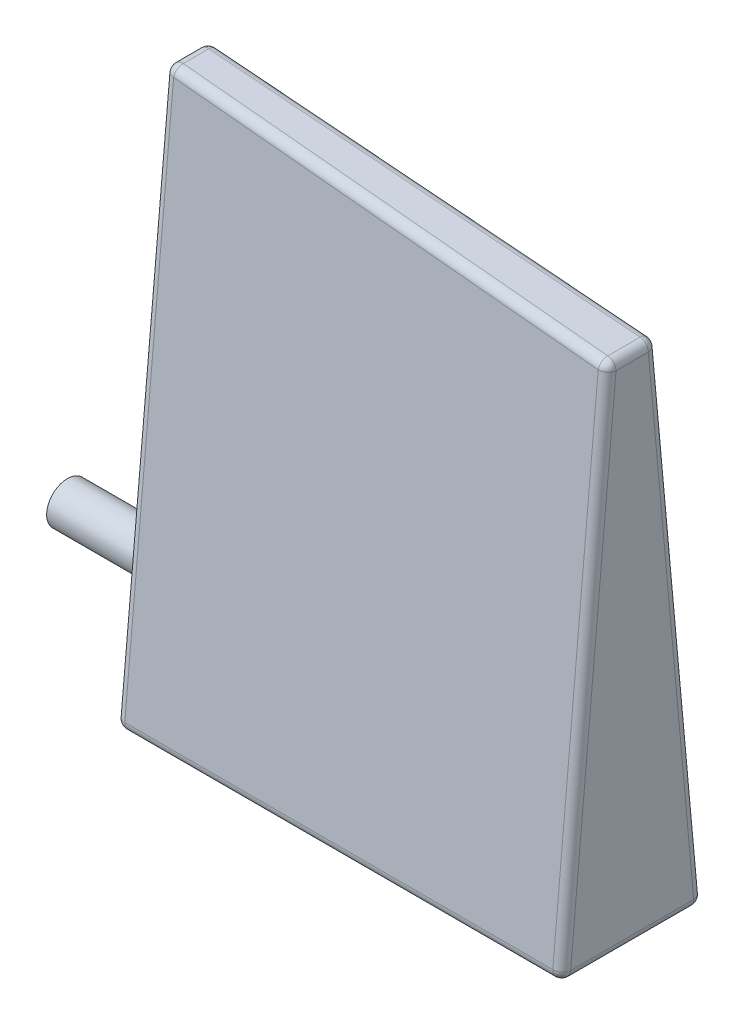
ISO-10303-21;
HEADER;
FILE_DESCRIPTION(('STEP AP214'),'2;1');
FILE_NAME('part.step','',(''),(''),'','','');
FILE_SCHEMA(('AUTOMOTIVE_DESIGN { 1 0 10303 214 1 1 1 1 }'));
ENDSEC;
DATA;
#1=APPLICATION_CONTEXT('core data for automotive mechanical design processes');
#2=APPLICATION_PROTOCOL_DEFINITION('international standard','automotive_design',2000,#1);
#3=PRODUCT_CONTEXT('',#1,'mechanical');
#4=PRODUCT('Part','Part','',(#3));
#5=PRODUCT_RELATED_PRODUCT_CATEGORY('part','',(#4));
#6=PRODUCT_DEFINITION_FORMATION('','',#4);
#7=PRODUCT_DEFINITION_CONTEXT('part definition',#1,'design');
#8=PRODUCT_DEFINITION('design','',#6,#7);
#9=PRODUCT_DEFINITION_SHAPE('','',#8);
#10=(LENGTH_UNIT() NAMED_UNIT(*) SI_UNIT(.MILLI.,.METRE.));
#11=(NAMED_UNIT(*) PLANE_ANGLE_UNIT() SI_UNIT($,.RADIAN.));
#12=(NAMED_UNIT(*) SI_UNIT($,.STERADIAN.) SOLID_ANGLE_UNIT());
#13=UNCERTAINTY_MEASURE_WITH_UNIT(LENGTH_MEASURE(1.E-05),#10,'distance_accuracy_value','');
#14=(GEOMETRIC_REPRESENTATION_CONTEXT(3) GLOBAL_UNCERTAINTY_ASSIGNED_CONTEXT((#13)) GLOBAL_UNIT_ASSIGNED_CONTEXT((#10,
#11,#12)) REPRESENTATION_CONTEXT('',''));
#15=CARTESIAN_POINT('',(0.,0.,0.));
#16=DIRECTION('',(0.,0.,1.));
#17=DIRECTION('',(1.,0.,0.));
#18=AXIS2_PLACEMENT_3D('',#15,#16,#17);
#19=CARTESIAN_POINT('',(37.5,-8.56475903614457,-6.));
#20=DIRECTION('',(0.,-0.0910184756337604,0.995849203992907));
#21=DIRECTION('',(0.,-0.995849203992907,-0.0910184756337604));
#22=AXIS2_PLACEMENT_3D('',#19,#20,#21);
#23=PLANE('',#22);
#24=DIRECTION('',(0.,0.995849203992907,0.0910184756337604));
#25=VECTOR('',#24,1.);
#26=CARTESIAN_POINT('',(36.75,-8.56475903614457,-6.));
#27=LINE('',#26,#25);
#28=CARTESIAN_POINT('',(36.75,34.0354315578454,-2.10643419302242));
#29=VERTEX_POINT('',#28);
#30=CARTESIAN_POINT('',(36.75,-7.74649517941925,-5.92521244320252));
#31=VERTEX_POINT('',#30);
#32=EDGE_CURVE('E238',#29,#31,#27,.F.);
#33=ORIENTED_EDGE('',*,*,#32,.T.);
#34=DIRECTION('',(-1.,0.,0.));
#35=VECTOR('',#34,1.);
#36=CARTESIAN_POINT('',(37.5,-7.74649517941925,-5.92521244320252));
#37=LINE('',#36,#35);
#38=CARTESIAN_POINT('',(0.750000000000001,-7.74649517941925,-5.92521244320252));
#39=VERTEX_POINT('',#38);
#40=EDGE_CURVE('E163',#31,#39,#37,.T.);
#41=ORIENTED_EDGE('',*,*,#40,.T.);
#42=DIRECTION('',(0.,0.995849203992907,0.0910184756337604));
#43=VECTOR('',#42,1.);
#44=CARTESIAN_POINT('',(0.750000000000001,37.9352409638554,-1.75));
#45=LINE('',#44,#43);
#46=CARTESIAN_POINT('',(0.750000000000001,37.1850234447788,-1.8185682678726));
#47=VERTEX_POINT('',#46);
#48=EDGE_CURVE('E236',#39,#47,#45,.T.);
#49=ORIENTED_EDGE('',*,*,#48,.T.);
#50=DIRECTION('',(-0.996163092965211,0.0871529776573808,0.0079655947321262));
#51=VECTOR('',#50,1.);
#52=CARTESIAN_POINT('',(37.4400674082605,33.9750584825539,-2.1119521622695));
#53=LINE('',#52,#51);
#54=EDGE_CURVE('E234',#47,#29,#53,.F.);
#55=ORIENTED_EDGE('',*,*,#54,.T.);
#56=EDGE_LOOP('',(#33,#41,#49,#55));
#57=FACE_BOUND('',#56,.T.);
#58=ADVANCED_FACE('F41',(#57),#23,.F.);
#59=CARTESIAN_POINT('',(37.5,-8.56475903614458,6.));
#60=DIRECTION('',(0.,-0.0910184756337603,-0.995849203992907));
#61=DIRECTION('',(0.,0.995849203992907,-0.0910184756337603));
#62=AXIS2_PLACEMENT_3D('',#59,#60,#61);
#63=PLANE('',#62);
#64=DIRECTION('',(0.,-0.995849203992907,0.0910184756337603));
#65=VECTOR('',#64,1.);
#66=CARTESIAN_POINT('',(0.750000000000001,-8.56475903614458,6.));
#67=LINE('',#66,#65);
#68=CARTESIAN_POINT('',(0.750000000000001,37.1850234447788,1.81856826787259));
#69=VERTEX_POINT('',#68);
#70=CARTESIAN_POINT('',(0.750000000000001,-7.74649517941925,5.92521244320252));
#71=VERTEX_POINT('',#70);
#72=EDGE_CURVE('E243',#69,#71,#67,.T.);
#73=ORIENTED_EDGE('',*,*,#72,.T.);
#74=DIRECTION('',(-1.,0.,0.));
#75=VECTOR('',#74,1.);
#76=CARTESIAN_POINT('',(37.5,-7.74649517941925,5.92521244320252));
#77=LINE('',#76,#75);
#78=CARTESIAN_POINT('',(36.75,-7.74649517941925,5.92521244320252));
#79=VERTEX_POINT('',#78);
#80=EDGE_CURVE('E247',#71,#79,#77,.F.);
#81=ORIENTED_EDGE('',*,*,#80,.T.);
#82=DIRECTION('',(0.,-0.995849203992907,0.0910184756337603));
#83=VECTOR('',#82,1.);
#84=CARTESIAN_POINT('',(36.75,-8.56475903614458,6.));
#85=LINE('',#84,#83);
#86=CARTESIAN_POINT('',(36.75,34.0354315578454,2.10643419302242));
#87=VERTEX_POINT('',#86);
#88=EDGE_CURVE('E245',#79,#87,#85,.F.);
#89=ORIENTED_EDGE('',*,*,#88,.T.);
#90=DIRECTION('',(0.996163092965211,-0.0871529776573808,0.0079655947321262));
#91=VECTOR('',#90,1.);
#92=CARTESIAN_POINT('',(-0.059932591739531,37.2558833647762,1.81209182357176));
#93=LINE('',#92,#91);
#94=EDGE_CURVE('E241',#87,#69,#93,.F.);
#95=ORIENTED_EDGE('',*,*,#94,.T.);
#96=EDGE_LOOP('',(#73,#81,#89,#95));
#97=FACE_BOUND('',#96,.T.);
#98=ADVANCED_FACE('F321',(#97),#63,.F.);
#99=CARTESIAN_POINT('',(37.5,0.,0.));
#100=DIRECTION('',(-1.,0.,0.));
#101=DIRECTION('',(0.,0.,1.));
#102=AXIS2_PLACEMENT_3D('',#99,#100,#101);
#103=PLANE('',#102);
#104=DIRECTION('',(0.,-0.995849203992907,0.0910184756337603));
#105=VECTOR('',#104,1.);
#106=CARTESIAN_POINT('',(37.5,0.404626630262044,4.42709136639649));
#107=LINE('',#106,#105);
#108=CARTESIAN_POINT('',(37.5,33.9671677011201,1.35954729002774));
#109=VERTEX_POINT('',#108);
#110=CARTESIAN_POINT('',(37.5,-7.81475903614458,5.17832554020784));
#111=VERTEX_POINT('',#110);
#112=EDGE_CURVE('E254',#109,#111,#107,.T.);
#113=ORIENTED_EDGE('',*,*,#112,.T.);
#114=DIRECTION('',(0.,0.,-1.));
#115=VECTOR('',#114,1.);
#116=CARTESIAN_POINT('',(37.5,-7.81475903614457,0.));
#117=LINE('',#116,#115);
#118=CARTESIAN_POINT('',(37.5,-7.81475903614457,-5.17832554020785));
#119=VERTEX_POINT('',#118);
#120=EDGE_CURVE('E256',#111,#119,#117,.T.);
#121=ORIENTED_EDGE('',*,*,#120,.T.);
#122=DIRECTION('',(0.,0.995849203992907,0.0910184756337604));
#123=VECTOR('',#122,1.);
#124=CARTESIAN_POINT('',(37.5,0.404626630262045,-4.42709136639649));
#125=LINE('',#124,#123);
#126=CARTESIAN_POINT('',(37.5,33.9671677011201,-1.35954729002774));
#127=VERTEX_POINT('',#126);
#128=EDGE_CURVE('E252',#119,#127,#125,.T.);
#129=ORIENTED_EDGE('',*,*,#128,.T.);
#130=DIRECTION('',(0.,0.,-1.));
#131=VECTOR('',#130,1.);
#132=CARTESIAN_POINT('',(37.5,33.9671677011201,2.04986033869774));
#133=LINE('',#132,#131);
#134=EDGE_CURVE('E250',#127,#109,#133,.F.);
#135=ORIENTED_EDGE('',*,*,#134,.T.);
#136=EDGE_LOOP('',(#113,#121,#129,#135));
#137=FACE_BOUND('',#136,.T.);
#138=ADVANCED_FACE('F308',(#137),#103,.F.);
#139=CARTESIAN_POINT('',(37.5,-8.56475903614458,6.));
#140=DIRECTION('',(0.,1.,0.));
#141=DIRECTION('',(0.,0.,1.));
#142=AXIS2_PLACEMENT_3D('',#139,#140,#141);
#143=PLANE('',#142);
#144=DIRECTION('',(-1.,0.,0.));
#145=VECTOR('',#144,1.);
#146=CARTESIAN_POINT('',(37.5,-8.56475903614458,5.17832554020784));
#147=LINE('',#146,#145);
#148=CARTESIAN_POINT('',(36.75,-8.56475903614458,5.17832554020784));
#149=VERTEX_POINT('',#148);
#150=CARTESIAN_POINT('',(0.750000000000001,-8.56475903614458,5.17832554020784));
#151=VERTEX_POINT('',#150);
#152=EDGE_CURVE('E139',#149,#151,#147,.T.);
#153=ORIENTED_EDGE('',*,*,#152,.T.);
#154=DIRECTION('',(0.,0.,-1.));
#155=VECTOR('',#154,1.);
#156=CARTESIAN_POINT('',(0.750000000000001,-8.56475903614457,-6.));
#157=LINE('',#156,#155);
#158=CARTESIAN_POINT('',(0.750000000000001,-8.56475903614457,-5.17832554020784));
#159=VERTEX_POINT('',#158);
#160=EDGE_CURVE('E135',#151,#159,#157,.T.);
#161=ORIENTED_EDGE('',*,*,#160,.T.);
#162=DIRECTION('',(-1.,0.,0.));
#163=VECTOR('',#162,1.);
#164=CARTESIAN_POINT('',(37.5,-8.56475903614457,-5.17832554020784));
#165=LINE('',#164,#163);
#166=CARTESIAN_POINT('',(36.75,-8.56475903614457,-5.17832554020784));
#167=VERTEX_POINT('',#166);
#168=EDGE_CURVE('E129',#159,#167,#165,.F.);
#169=ORIENTED_EDGE('',*,*,#168,.T.);
#170=DIRECTION('',(0.,0.,-1.));
#171=VECTOR('',#170,1.);
#172=CARTESIAN_POINT('',(36.75,-8.56475903614458,6.));
#173=LINE('',#172,#171);
#174=EDGE_CURVE('E132',#167,#149,#173,.F.);
#175=ORIENTED_EDGE('',*,*,#174,.T.);
#176=EDGE_LOOP('',(#153,#161,#169,#175));
#177=FACE_BOUND('',#176,.T.);
#178=ADVANCED_FACE('F131',(#177),#143,.F.);
#179=CARTESIAN_POINT('',(0.,0.,0.));
#180=DIRECTION('',(-1.,0.,0.));
#181=DIRECTION('',(0.,0.,1.));
#182=AXIS2_PLACEMENT_3D('',#179,#180,#181);
#183=PLANE('',#182);
#184=DIRECTION('',(0.,0.,-1.));
#185=VECTOR('',#184,1.);
#186=CARTESIAN_POINT('',(0.,-7.81475903614457,6.));
#187=LINE('',#186,#185);
#188=CARTESIAN_POINT('',(0.,-7.81475903614457,-5.17832554020784));
#189=VERTEX_POINT('',#188);
#190=CARTESIAN_POINT('',(0.,-7.81475903614457,5.17832554020784));
#191=VERTEX_POINT('',#190);
#192=EDGE_CURVE('E229',#189,#191,#187,.F.);
#193=ORIENTED_EDGE('',*,*,#192,.T.);
#194=DIRECTION('',(0.,-0.995849203992907,0.0910184756337603));
#195=VECTOR('',#194,1.);
#196=CARTESIAN_POINT('',(0.,37.8669771071301,1.00311309700532));
#197=LINE('',#196,#195);
#198=CARTESIAN_POINT('',(0.,37.1167595880535,1.07168136487792));
#199=VERTEX_POINT('',#198);
#200=EDGE_CURVE('E232',#191,#199,#197,.F.);
#201=ORIENTED_EDGE('',*,*,#200,.T.);
#202=DIRECTION('',(0.,0.,1.));
#203=VECTOR('',#202,1.);
#204=CARTESIAN_POINT('',(0.,37.1167595880535,0.));
#205=LINE('',#204,#203);
#206=CARTESIAN_POINT('',(0.,37.1167595880535,-1.07168136487792));
#207=VERTEX_POINT('',#206);
#208=EDGE_CURVE('E227',#199,#207,#205,.F.);
#209=ORIENTED_EDGE('',*,*,#208,.T.);
#210=DIRECTION('',(0.,0.995849203992907,0.0910184756337604));
#211=VECTOR('',#210,1.);
#212=CARTESIAN_POINT('',(0.,-8.63302289286989,-5.25311309700532));
#213=LINE('',#212,#211);
#214=EDGE_CURVE('E225',#207,#189,#213,.F.);
#215=ORIENTED_EDGE('',*,*,#214,.T.);
#216=EDGE_LOOP('',(#193,#201,#209,#215));
#217=FACE_BOUND('',#216,.T.);
#218=CARTESIAN_POINT('',(0.,-0.064759036144571,0.));
#219=DIRECTION('',(-1.,0.,0.));
#220=DIRECTION('',(0.,0.,1.));
#221=AXIS2_PLACEMENT_3D('',#218,#219,#220);
#222=CIRCLE('',#221,1.75);
#223=CARTESIAN_POINT('',(0.,-0.064759036144571,1.75));
#224=VERTEX_POINT('',#223);
#225=EDGE_CURVE('E211',#224,#224,#222,.T.);
#226=ORIENTED_EDGE('',*,*,#225,.F.);
#227=EDGE_LOOP('',(#226));
#228=FACE_BOUND('',#227,.T.);
#229=ADVANCED_FACE('F288',(#217,#228),#183,.T.);
#230=CARTESIAN_POINT('',(37.5,34.6544160816331,37.5));
#231=DIRECTION('',(0.0871557427476619,0.996194698091745,0.));
#232=DIRECTION('',(-0.996194698091745,0.0871557427476619,0.));
#233=AXIS2_PLACEMENT_3D('',#230,#231,#232);
#234=PLANE('',#233);
#235=DIRECTION('',(0.,0.,1.));
#236=VECTOR('',#235,1.);
#237=CARTESIAN_POINT('',(0.815366807060749,37.8639056116223,37.5));
#238=LINE('',#237,#236);
#239=CARTESIAN_POINT('',(0.815366807060748,37.8639056116223,-1.07168136487791));
#240=VERTEX_POINT('',#239);
#241=CARTESIAN_POINT('',(0.815366807060748,37.8639056116223,1.07168136487792));
#242=VERTEX_POINT('',#241);
#243=EDGE_CURVE('E61',#240,#242,#238,.T.);
#244=ORIENTED_EDGE('',*,*,#243,.T.);
#245=DIRECTION('',(0.996163092965211,-0.0871529776573808,0.0079655947321262));
#246=VECTOR('',#245,1.);
#247=CARTESIAN_POINT('',(37.5054342153212,34.6539406493974,1.36506525927482));
#248=LINE('',#247,#246);
#249=CARTESIAN_POINT('',(36.8153668070607,34.7143137246889,1.35954729002774));
#250=VERTEX_POINT('',#249);
#251=EDGE_CURVE('E11',#242,#250,#248,.T.);
#252=ORIENTED_EDGE('',*,*,#251,.T.);
#253=DIRECTION('',(0.,0.,-1.));
#254=VECTOR('',#253,1.);
#255=CARTESIAN_POINT('',(36.8153668070607,34.7143137246889,-2.04986033869774));
#256=LINE('',#255,#254);
#257=CARTESIAN_POINT('',(36.8153668070607,34.7143137246889,-1.35954729002774));
#258=VERTEX_POINT('',#257);
#259=EDGE_CURVE('E50',#250,#258,#256,.T.);
#260=ORIENTED_EDGE('',*,*,#259,.T.);
#261=DIRECTION('',(-0.996163092965211,0.0871529776573808,0.0079655947321262));
#262=VECTOR('',#261,1.);
#263=CARTESIAN_POINT('',(0.00543421532122278,37.9347655316197,-1.06520492057708));
#264=LINE('',#263,#262);
#265=EDGE_CURVE('E259',#258,#240,#264,.T.);
#266=ORIENTED_EDGE('',*,*,#265,.T.);
#267=EDGE_LOOP('',(#244,#252,#260,#266));
#268=FACE_BOUND('',#267,.T.);
#269=ADVANCED_FACE('F518',(#268),#234,.T.);
#270=CARTESIAN_POINT('',(-10.,-0.064759036144571,0.));
#271=DIRECTION('',(1.,0.,0.));
#272=DIRECTION('',(0.,0.,-1.));
#273=AXIS2_PLACEMENT_3D('',#270,#271,#272);
#274=CYLINDRICAL_SURFACE('',#273,1.75);
#275=CARTESIAN_POINT('',(-10.,-0.064759036144571,0.));
#276=DIRECTION('',(-1.,0.,0.));
#277=DIRECTION('',(0.,0.,1.));
#278=AXIS2_PLACEMENT_3D('',#275,#276,#277);
#279=CIRCLE('',#278,1.75);
#280=CARTESIAN_POINT('',(-10.,-0.064759036144571,1.75));
#281=VERTEX_POINT('',#280);
#282=EDGE_CURVE('E151',#281,#281,#279,.T.);
#283=ORIENTED_EDGE('',*,*,#282,.F.);
#284=EDGE_LOOP('',(#283));
#285=FACE_BOUND('',#284,.T.);
#286=ORIENTED_EDGE('',*,*,#225,.T.);
#287=EDGE_LOOP('',(#286));
#288=FACE_BOUND('',#287,.T.);
#289=ADVANCED_FACE('F509',(#285,#288),#274,.T.);
#290=CARTESIAN_POINT('',(-10.,-0.064759036144571,0.));
#291=DIRECTION('',(-1.,0.,0.));
#292=DIRECTION('',(0.,0.,1.));
#293=AXIS2_PLACEMENT_3D('',#290,#291,#292);
#294=PLANE('',#293);
#295=ORIENTED_EDGE('',*,*,#282,.T.);
#296=EDGE_LOOP('',(#295));
#297=FACE_BOUND('',#296,.T.);
#298=ADVANCED_FACE('F502',(#297),#294,.T.);
#299=CARTESIAN_POINT('',(36.75,33.9671677011201,37.5));
#300=DIRECTION('',(0.,0.,1.));
#301=DIRECTION('',(1.,0.,0.));
#302=AXIS2_PLACEMENT_3D('',#299,#300,#301);
#303=CYLINDRICAL_SURFACE('',#302,0.75);
#304=CARTESIAN_POINT('',(36.75,33.9671677011201,1.35954729002774));
#305=DIRECTION('',(0.,0.,1.));
#306=DIRECTION('',(0.,-1.,0.));
#307=AXIS2_PLACEMENT_3D('',#304,#305,#306);
#308=CIRCLE('',#307,0.75);
#309=EDGE_CURVE('E45',#109,#250,#308,.T.);
#310=ORIENTED_EDGE('',*,*,#309,.F.);
#311=ORIENTED_EDGE('',*,*,#134,.F.);
#312=CARTESIAN_POINT('',(36.75,33.9671677011201,-1.35954729002774));
#313=DIRECTION('',(0.,0.,-1.));
#314=DIRECTION('',(-1.,0.,0.));
#315=AXIS2_PLACEMENT_3D('',#312,#313,#314);
#316=CIRCLE('',#315,0.75);
#317=EDGE_CURVE('E204',#258,#127,#316,.T.);
#318=ORIENTED_EDGE('',*,*,#317,.F.);
#319=ORIENTED_EDGE('',*,*,#259,.F.);
#320=EDGE_LOOP('',(#310,#311,#318,#319));
#321=FACE_BOUND('',#320,.T.);
#322=ADVANCED_FACE('F43',(#321),#303,.T.);
#323=CARTESIAN_POINT('',(36.75,33.9671677011201,1.35954729002774));
#324=DIRECTION('',(0.0871557427476649,0.996194698091745,0.));
#325=DIRECTION('',(-0.996194698091745,0.0871557427476649,0.));
#326=AXIS2_PLACEMENT_3D('',#323,#324,#325);
#327=SPHERICAL_SURFACE('',#326,0.75);
#328=CARTESIAN_POINT('',(36.75,33.9671677011201,1.35954729002774));
#329=DIRECTION('',(0.,0.995849203992907,-0.0910184756337621));
#330=DIRECTION('',(0.,0.0910184756337621,0.995849203992907));
#331=AXIS2_PLACEMENT_3D('',#328,#329,#330);
#332=CIRCLE('',#331,0.75);
#333=EDGE_CURVE('E199',#109,#87,#332,.F.);
#334=ORIENTED_EDGE('',*,*,#333,.F.);
#335=ORIENTED_EDGE('',*,*,#309,.T.);
#336=CARTESIAN_POINT('',(36.75,33.9671677011201,1.35954729002774));
#337=DIRECTION('',(0.996163092965211,-0.0871529776573838,0.00796559473212749));
#338=DIRECTION('',(0.0871557427476649,0.996194698091745,0.));
#339=AXIS2_PLACEMENT_3D('',#336,#337,#338);
#340=CIRCLE('',#339,0.75);
#341=EDGE_CURVE('E202',#87,#250,#340,.F.);
#342=ORIENTED_EDGE('',*,*,#341,.F.);
#343=EDGE_LOOP('',(#334,#335,#342));
#344=FACE_BOUND('',#343,.T.);
#345=ADVANCED_FACE('F339',(#344),#327,.T.);
#346=CARTESIAN_POINT('',(36.75,33.9671677011201,-1.35954729002774));
#347=DIRECTION('',(0.0871557427476649,0.996194698091745,0.));
#348=DIRECTION('',(-0.996194698091745,0.0871557427476649,0.));
#349=AXIS2_PLACEMENT_3D('',#346,#347,#348);
#350=SPHERICAL_SURFACE('',#349,0.75);
#351=CARTESIAN_POINT('',(36.75,33.9671677011201,-1.35954729002774));
#352=DIRECTION('',(0.996163092965211,-0.0871529776573838,-0.00796559473212663));
#353=DIRECTION('',(0.0871557427476648,0.996194698091745,0.));
#354=AXIS2_PLACEMENT_3D('',#351,#352,#353);
#355=CIRCLE('',#354,0.75);
#356=EDGE_CURVE('E193',#258,#29,#355,.F.);
#357=ORIENTED_EDGE('',*,*,#356,.F.);
#358=ORIENTED_EDGE('',*,*,#317,.T.);
#359=CARTESIAN_POINT('',(36.75,33.9671677011201,-1.35954729002774));
#360=DIRECTION('',(0.,0.995849203992907,0.0910184756337622));
#361=DIRECTION('',(0.,-0.0910184756337622,0.995849203992907));
#362=AXIS2_PLACEMENT_3D('',#359,#360,#361);
#363=CIRCLE('',#362,0.75);
#364=EDGE_CURVE('E196',#29,#127,#363,.F.);
#365=ORIENTED_EDGE('',*,*,#364,.F.);
#366=EDGE_LOOP('',(#357,#358,#365));
#367=FACE_BOUND('',#366,.T.);
#368=ADVANCED_FACE('F337',(#367),#350,.T.);
#369=CARTESIAN_POINT('',(37.721365382644,33.8821842419972,1.36731459543145));
#370=DIRECTION('',(-0.996163092965211,0.0871529776573808,-0.0079655947321262));
#371=DIRECTION('',(-0.0871557427476618,-0.996194698091745,0.));
#372=AXIS2_PLACEMENT_3D('',#369,#370,#371);
#373=CYLINDRICAL_SURFACE('',#372,0.75);
#374=ORIENTED_EDGE('',*,*,#341,.T.);
#375=ORIENTED_EDGE('',*,*,#251,.F.);
#376=CARTESIAN_POINT('',(0.750000000000001,37.1167595880535,1.07168136487791));
#377=DIRECTION('',(-0.996163092965211,0.0871529776573824,-0.0079655947321265));
#378=DIRECTION('',(-0.0871557427476634,-0.996194698091745,0.));
#379=AXIS2_PLACEMENT_3D('',#376,#377,#378);
#380=CIRCLE('',#379,0.75);
#381=EDGE_CURVE('E187',#69,#242,#380,.T.);
#382=ORIENTED_EDGE('',*,*,#381,.F.);
#383=ORIENTED_EDGE('',*,*,#94,.F.);
#384=EDGE_LOOP('',(#374,#375,#382,#383));
#385=FACE_BOUND('',#384,.T.);
#386=ADVANCED_FACE('F325',(#385),#373,.T.);
#387=CARTESIAN_POINT('',(36.75,0.404626630262044,4.42709136639649));
#388=DIRECTION('',(0.,-0.995849203992907,0.0910184756337603));
#389=DIRECTION('',(0.,-0.0910184756337603,-0.995849203992907));
#390=AXIS2_PLACEMENT_3D('',#387,#388,#389);
#391=CYLINDRICAL_SURFACE('',#390,0.75);
#392=ORIENTED_EDGE('',*,*,#333,.T.);
#393=ORIENTED_EDGE('',*,*,#88,.F.);
#394=CARTESIAN_POINT('',(36.75,-7.81475903614458,5.17832554020784));
#395=DIRECTION('',(0.,-0.995849203992907,0.0910184756337622));
#396=DIRECTION('',(0.,-0.0910184756337622,-0.995849203992907));
#397=AXIS2_PLACEMENT_3D('',#394,#395,#396);
#398=CIRCLE('',#397,0.75);
#399=EDGE_CURVE('E184',#111,#79,#398,.T.);
#400=ORIENTED_EDGE('',*,*,#399,.F.);
#401=ORIENTED_EDGE('',*,*,#112,.F.);
#402=EDGE_LOOP('',(#392,#393,#400,#401));
#403=FACE_BOUND('',#402,.T.);
#404=ADVANCED_FACE('F313',(#403),#391,.T.);
#405=CARTESIAN_POINT('',(36.75,-7.81475903614457,0.));
#406=DIRECTION('',(0.,0.,-1.));
#407=DIRECTION('',(0.,1.,0.));
#408=AXIS2_PLACEMENT_3D('',#405,#406,#407);
#409=CYLINDRICAL_SURFACE('',#408,0.75);
#410=CARTESIAN_POINT('',(36.75,-7.81475903614457,-5.17832554020785));
#411=DIRECTION('',(0.,0.,-1.));
#412=DIRECTION('',(0.,1.,0.));
#413=AXIS2_PLACEMENT_3D('',#410,#411,#412);
#414=CIRCLE('',#413,0.75);
#415=EDGE_CURVE('E146',#119,#167,#414,.T.);
#416=ORIENTED_EDGE('',*,*,#415,.F.);
#417=ORIENTED_EDGE('',*,*,#120,.F.);
#418=CARTESIAN_POINT('',(36.75,-7.81475903614457,5.17832554020784));
#419=DIRECTION('',(0.,0.,1.));
#420=DIRECTION('',(1.,0.,0.));
#421=AXIS2_PLACEMENT_3D('',#418,#419,#420);
#422=CIRCLE('',#421,0.75);
#423=EDGE_CURVE('E149',#149,#111,#422,.T.);
#424=ORIENTED_EDGE('',*,*,#423,.F.);
#425=ORIENTED_EDGE('',*,*,#174,.F.);
#426=EDGE_LOOP('',(#416,#417,#424,#425));
#427=FACE_BOUND('',#426,.T.);
#428=ADVANCED_FACE('F144',(#427),#409,.T.);
#429=CARTESIAN_POINT('',(36.75,0.404626630262045,-4.42709136639649));
#430=DIRECTION('',(0.,0.995849203992907,0.0910184756337604));
#431=DIRECTION('',(0.,-0.0910184756337604,0.995849203992907));
#432=AXIS2_PLACEMENT_3D('',#429,#430,#431);
#433=CYLINDRICAL_SURFACE('',#432,0.75);
#434=ORIENTED_EDGE('',*,*,#364,.T.);
#435=ORIENTED_EDGE('',*,*,#128,.F.);
#436=CARTESIAN_POINT('',(36.75,-7.81475903614457,-5.17832554020784));
#437=DIRECTION('',(0.,-0.995849203992907,-0.091018475633761));
#438=DIRECTION('',(0.,0.091018475633761,-0.995849203992907));
#439=AXIS2_PLACEMENT_3D('',#436,#437,#438);
#440=CIRCLE('',#439,0.75);
#441=EDGE_CURVE('E159',#31,#119,#440,.T.);
#442=ORIENTED_EDGE('',*,*,#441,.F.);
#443=ORIENTED_EDGE('',*,*,#32,.F.);
#444=EDGE_LOOP('',(#434,#435,#442,#443));
#445=FACE_BOUND('',#444,.T.);
#446=ADVANCED_FACE('F305',(#445),#433,.T.);
#447=CARTESIAN_POINT('',(37.1262380212194,33.9342511394759,-1.36255579297371));
#448=DIRECTION('',(0.996163092965211,-0.0871529776573808,-0.0079655947321262));
#449=DIRECTION('',(0.0871557427476618,0.996194698091745,0.));
#450=AXIS2_PLACEMENT_3D('',#447,#448,#449);
#451=CYLINDRICAL_SURFACE('',#450,0.75);
#452=ORIENTED_EDGE('',*,*,#356,.T.);
#453=ORIENTED_EDGE('',*,*,#54,.F.);
#454=CARTESIAN_POINT('',(0.750000000000001,37.1167595880535,-1.07168136487791));
#455=DIRECTION('',(-0.996163092965211,0.0871529776573807,0.0079655947321272));
#456=DIRECTION('',(-0.0871557427476617,-0.996194698091745,0.));
#457=AXIS2_PLACEMENT_3D('',#454,#455,#456);
#458=CIRCLE('',#457,0.75);
#459=EDGE_CURVE('E179',#240,#47,#458,.T.);
#460=ORIENTED_EDGE('',*,*,#459,.F.);
#461=ORIENTED_EDGE('',*,*,#265,.F.);
#462=EDGE_LOOP('',(#452,#453,#460,#461));
#463=FACE_BOUND('',#462,.T.);
#464=ADVANCED_FACE('F336',(#463),#451,.T.);
#465=CARTESIAN_POINT('',(0.750000000000001,37.1167595880535,37.5));
#466=DIRECTION('',(0.,0.,1.));
#467=DIRECTION('',(1.,0.,0.));
#468=AXIS2_PLACEMENT_3D('',#465,#466,#467);
#469=CYLINDRICAL_SURFACE('',#468,0.75);
#470=CARTESIAN_POINT('',(0.750000000000001,37.1167595880535,1.07168136487792));
#471=DIRECTION('',(0.,0.,1.));
#472=DIRECTION('',(1.,0.,0.));
#473=AXIS2_PLACEMENT_3D('',#470,#471,#472);
#474=CIRCLE('',#473,0.75);
#475=EDGE_CURVE('E190',#242,#199,#474,.T.);
#476=ORIENTED_EDGE('',*,*,#475,.F.);
#477=ORIENTED_EDGE('',*,*,#243,.F.);
#478=CARTESIAN_POINT('',(0.75,37.1167595880535,-1.07168136487792));
#479=DIRECTION('',(0.,0.,-1.));
#480=DIRECTION('',(0.,1.,0.));
#481=AXIS2_PLACEMENT_3D('',#478,#479,#480);
#482=CIRCLE('',#481,0.75);
#483=EDGE_CURVE('E176',#207,#240,#482,.T.);
#484=ORIENTED_EDGE('',*,*,#483,.F.);
#485=ORIENTED_EDGE('',*,*,#208,.F.);
#486=EDGE_LOOP('',(#476,#477,#484,#485));
#487=FACE_BOUND('',#486,.T.);
#488=ADVANCED_FACE('F330',(#487),#469,.T.);
#489=CARTESIAN_POINT('',(0.75,37.1167595880535,1.07168136487792));
#490=DIRECTION('',(-1.,0.,0.));
#491=DIRECTION('',(0.,0.,1.));
#492=AXIS2_PLACEMENT_3D('',#489,#490,#491);
#493=SPHERICAL_SURFACE('',#492,0.75);
#494=ORIENTED_EDGE('',*,*,#381,.T.);
#495=ORIENTED_EDGE('',*,*,#475,.T.);
#496=CARTESIAN_POINT('',(0.75,37.1167595880535,1.07168136487792));
#497=DIRECTION('',(0.,0.995849203992906,-0.0910184756337715));
#498=DIRECTION('',(0.,0.0910184756337715,0.995849203992906));
#499=AXIS2_PLACEMENT_3D('',#496,#497,#498);
#500=CIRCLE('',#499,0.75);
#501=EDGE_CURVE('E167',#69,#199,#500,.F.);
#502=ORIENTED_EDGE('',*,*,#501,.F.);
#503=EDGE_LOOP('',(#494,#495,#502));
#504=FACE_BOUND('',#503,.T.);
#505=ADVANCED_FACE('F328',(#504),#493,.T.);
#506=CARTESIAN_POINT('',(36.75,-7.81475903614457,5.17832554020784));
#507=DIRECTION('',(1.,0.,0.));
#508=DIRECTION('',(0.,1.,0.));
#509=AXIS2_PLACEMENT_3D('',#506,#507,#508);
#510=SPHERICAL_SURFACE('',#509,0.75);
#511=ORIENTED_EDGE('',*,*,#423,.T.);
#512=ORIENTED_EDGE('',*,*,#399,.T.);
#513=CARTESIAN_POINT('',(36.75,-7.81475903614457,5.17832554020784));
#514=DIRECTION('',(1.,0.,0.));
#515=DIRECTION('',(0.,0.,-1.));
#516=AXIS2_PLACEMENT_3D('',#513,#514,#515);
#517=CIRCLE('',#516,0.75);
#518=EDGE_CURVE('E164',#149,#79,#517,.F.);
#519=ORIENTED_EDGE('',*,*,#518,.F.);
#520=EDGE_LOOP('',(#511,#512,#519));
#521=FACE_BOUND('',#520,.T.);
#522=ADVANCED_FACE('F315',(#521),#510,.T.);
#523=CARTESIAN_POINT('',(36.75,-7.81475903614457,-5.17832554020784));
#524=DIRECTION('',(1.,0.,0.));
#525=DIRECTION('',(0.,1.,0.));
#526=AXIS2_PLACEMENT_3D('',#523,#524,#525);
#527=SPHERICAL_SURFACE('',#526,0.75);
#528=ORIENTED_EDGE('',*,*,#441,.T.);
#529=ORIENTED_EDGE('',*,*,#415,.T.);
#530=CARTESIAN_POINT('',(36.75,-7.81475903614457,-5.17832554020784));
#531=DIRECTION('',(1.,0.,0.));
#532=DIRECTION('',(0.,0.,-1.));
#533=AXIS2_PLACEMENT_3D('',#530,#531,#532);
#534=CIRCLE('',#533,0.75);
#535=EDGE_CURVE('E156',#31,#167,#534,.F.);
#536=ORIENTED_EDGE('',*,*,#535,.F.);
#537=EDGE_LOOP('',(#528,#529,#536));
#538=FACE_BOUND('',#537,.T.);
#539=ADVANCED_FACE('F155',(#538),#527,.T.);
#540=CARTESIAN_POINT('',(0.750000000000001,37.1167595880535,-1.07168136487792));
#541=DIRECTION('',(-1.,0.,0.));
#542=DIRECTION('',(0.,0.,1.));
#543=AXIS2_PLACEMENT_3D('',#540,#541,#542);
#544=SPHERICAL_SURFACE('',#543,0.75);
#545=ORIENTED_EDGE('',*,*,#483,.T.);
#546=ORIENTED_EDGE('',*,*,#459,.T.);
#547=CARTESIAN_POINT('',(0.750000000000001,37.1167595880535,-1.07168136487792));
#548=DIRECTION('',(0.,0.995849203992907,0.0910184756337621));
#549=DIRECTION('',(0.,-0.0910184756337621,0.995849203992907));
#550=AXIS2_PLACEMENT_3D('',#547,#548,#549);
#551=CIRCLE('',#550,0.75);
#552=EDGE_CURVE('E165',#207,#47,#551,.F.);
#553=ORIENTED_EDGE('',*,*,#552,.F.);
#554=EDGE_LOOP('',(#545,#546,#553));
#555=FACE_BOUND('',#554,.T.);
#556=ADVANCED_FACE('F334',(#555),#544,.T.);
#557=CARTESIAN_POINT('',(0.750000000000001,-8.6330228928699,5.25311309700532));
#558=DIRECTION('',(0.,0.995849203992907,-0.0910184756337603));
#559=DIRECTION('',(0.,0.0910184756337603,0.995849203992907));
#560=AXIS2_PLACEMENT_3D('',#557,#558,#559);
#561=CYLINDRICAL_SURFACE('',#560,0.75);
#562=ORIENTED_EDGE('',*,*,#501,.T.);
#563=ORIENTED_EDGE('',*,*,#200,.F.);
#564=CARTESIAN_POINT('',(0.750000000000001,-7.81475903614457,5.17832554020784));
#565=DIRECTION('',(0.,-0.995849203992907,0.0910184756337598));
#566=DIRECTION('',(0.,-0.0910184756337598,-0.995849203992907));
#567=AXIS2_PLACEMENT_3D('',#564,#565,#566);
#568=CIRCLE('',#567,0.75);
#569=EDGE_CURVE('E170',#71,#191,#568,.T.);
#570=ORIENTED_EDGE('',*,*,#569,.F.);
#571=ORIENTED_EDGE('',*,*,#72,.F.);
#572=EDGE_LOOP('',(#562,#563,#570,#571));
#573=FACE_BOUND('',#572,.T.);
#574=ADVANCED_FACE('F283',(#573),#561,.T.);
#575=CARTESIAN_POINT('',(37.5,-7.81475903614457,5.17832554020784));
#576=DIRECTION('',(-1.,0.,0.));
#577=DIRECTION('',(0.,0.,1.));
#578=AXIS2_PLACEMENT_3D('',#575,#576,#577);
#579=CYLINDRICAL_SURFACE('',#578,0.75);
#580=ORIENTED_EDGE('',*,*,#518,.T.);
#581=ORIENTED_EDGE('',*,*,#80,.F.);
#582=CARTESIAN_POINT('',(0.750000000000001,-7.81475903614457,5.17832554020784));
#583=DIRECTION('',(-1.,0.,0.));
#584=DIRECTION('',(0.,0.,1.));
#585=AXIS2_PLACEMENT_3D('',#582,#583,#584);
#586=CIRCLE('',#585,0.75);
#587=EDGE_CURVE('E272',#151,#71,#586,.T.);
#588=ORIENTED_EDGE('',*,*,#587,.F.);
#589=ORIENTED_EDGE('',*,*,#152,.F.);
#590=EDGE_LOOP('',(#580,#581,#588,#589));
#591=FACE_BOUND('',#590,.T.);
#592=ADVANCED_FACE('F319',(#591),#579,.T.);
#593=CARTESIAN_POINT('',(37.5,-7.81475903614457,-5.17832554020784));
#594=DIRECTION('',(-1.,0.,0.));
#595=DIRECTION('',(0.,0.,1.));
#596=AXIS2_PLACEMENT_3D('',#593,#594,#595);
#597=CYLINDRICAL_SURFACE('',#596,0.75);
#598=ORIENTED_EDGE('',*,*,#535,.T.);
#599=ORIENTED_EDGE('',*,*,#168,.F.);
#600=CARTESIAN_POINT('',(0.750000000000001,-7.81475903614457,-5.17832554020784));
#601=DIRECTION('',(-1.,0.,0.));
#602=DIRECTION('',(0.,0.,1.));
#603=AXIS2_PLACEMENT_3D('',#600,#601,#602);
#604=CIRCLE('',#603,0.75);
#605=EDGE_CURVE('E269',#39,#159,#604,.T.);
#606=ORIENTED_EDGE('',*,*,#605,.F.);
#607=ORIENTED_EDGE('',*,*,#40,.F.);
#608=EDGE_LOOP('',(#598,#599,#606,#607));
#609=FACE_BOUND('',#608,.T.);
#610=ADVANCED_FACE('F161',(#609),#597,.T.);
#611=CARTESIAN_POINT('',(0.750000000000001,-8.63302289286989,-5.25311309700532));
#612=DIRECTION('',(0.,-0.995849203992907,-0.0910184756337604));
#613=DIRECTION('',(0.,0.0910184756337604,-0.995849203992907));
#614=AXIS2_PLACEMENT_3D('',#611,#612,#613);
#615=CYLINDRICAL_SURFACE('',#614,0.75);
#616=ORIENTED_EDGE('',*,*,#552,.T.);
#617=ORIENTED_EDGE('',*,*,#48,.F.);
#618=CARTESIAN_POINT('',(0.75,-7.81475903614457,-5.17832554020784));
#619=DIRECTION('',(0.,-0.995849203992907,-0.0910184756337609));
#620=DIRECTION('',(0.,0.091018475633761,-0.995849203992907));
#621=AXIS2_PLACEMENT_3D('',#618,#619,#620);
#622=CIRCLE('',#621,0.75);
#623=EDGE_CURVE('E267',#189,#39,#622,.T.);
#624=ORIENTED_EDGE('',*,*,#623,.F.);
#625=ORIENTED_EDGE('',*,*,#214,.F.);
#626=EDGE_LOOP('',(#616,#617,#624,#625));
#627=FACE_BOUND('',#626,.T.);
#628=ADVANCED_FACE('F299',(#627),#615,.T.);
#629=CARTESIAN_POINT('',(0.75,-7.81475903614457,5.17832554020784));
#630=DIRECTION('',(-1.,0.,0.));
#631=DIRECTION('',(0.,0.,1.));
#632=AXIS2_PLACEMENT_3D('',#629,#630,#631);
#633=SPHERICAL_SURFACE('',#632,0.75);
#634=ORIENTED_EDGE('',*,*,#587,.T.);
#635=ORIENTED_EDGE('',*,*,#569,.T.);
#636=CARTESIAN_POINT('',(0.75,-7.81475903614457,5.17832554020784));
#637=DIRECTION('',(0.,0.,1.));
#638=DIRECTION('',(1.,0.,0.));
#639=AXIS2_PLACEMENT_3D('',#636,#637,#638);
#640=CIRCLE('',#639,0.75);
#641=EDGE_CURVE('E265',#151,#191,#640,.F.);
#642=ORIENTED_EDGE('',*,*,#641,.F.);
#643=EDGE_LOOP('',(#634,#635,#642));
#644=FACE_BOUND('',#643,.T.);
#645=ADVANCED_FACE('F279',(#644),#633,.T.);
#646=CARTESIAN_POINT('',(0.75,-7.81475903614457,-5.17832554020784));
#647=DIRECTION('',(-1.,0.,0.));
#648=DIRECTION('',(0.,0.,1.));
#649=AXIS2_PLACEMENT_3D('',#646,#647,#648);
#650=SPHERICAL_SURFACE('',#649,0.75);
#651=ORIENTED_EDGE('',*,*,#623,.T.);
#652=ORIENTED_EDGE('',*,*,#605,.T.);
#653=CARTESIAN_POINT('',(0.750000000000001,-7.81475903614457,-5.17832554020784));
#654=DIRECTION('',(0.,0.,-1.));
#655=DIRECTION('',(-1.,0.,0.));
#656=AXIS2_PLACEMENT_3D('',#653,#654,#655);
#657=CIRCLE('',#656,0.75);
#658=EDGE_CURVE('E263',#189,#159,#657,.F.);
#659=ORIENTED_EDGE('',*,*,#658,.F.);
#660=EDGE_LOOP('',(#651,#652,#659));
#661=FACE_BOUND('',#660,.T.);
#662=ADVANCED_FACE('F296',(#661),#650,.T.);
#663=CARTESIAN_POINT('',(0.750000000000001,-7.81475903614457,6.));
#664=DIRECTION('',(0.,0.,1.));
#665=DIRECTION('',(0.,-1.,0.));
#666=AXIS2_PLACEMENT_3D('',#663,#664,#665);
#667=CYLINDRICAL_SURFACE('',#666,0.75);
#668=ORIENTED_EDGE('',*,*,#641,.T.);
#669=ORIENTED_EDGE('',*,*,#192,.F.);
#670=ORIENTED_EDGE('',*,*,#658,.T.);
#671=ORIENTED_EDGE('',*,*,#160,.F.);
#672=EDGE_LOOP('',(#668,#669,#670,#671));
#673=FACE_BOUND('',#672,.T.);
#674=ADVANCED_FACE('F294',(#673),#667,.T.);
#675=CLOSED_SHELL('',(#58,#98,#138,#178,#229,#269,#289,#298,#322,#345,#368,#386,#404,#428,#446,
#464,#488,#505,#522,#539,#556,#574,#592,#610,#628,#645,#662,#674));
#676=MANIFOLD_SOLID_BREP('B2',#675);
#677=ADVANCED_BREP_SHAPE_REPRESENTATION('',(#18,#676),#14);
#678=SHAPE_DEFINITION_REPRESENTATION(#9,#677);
ENDSEC;
END-ISO-10303-21;
